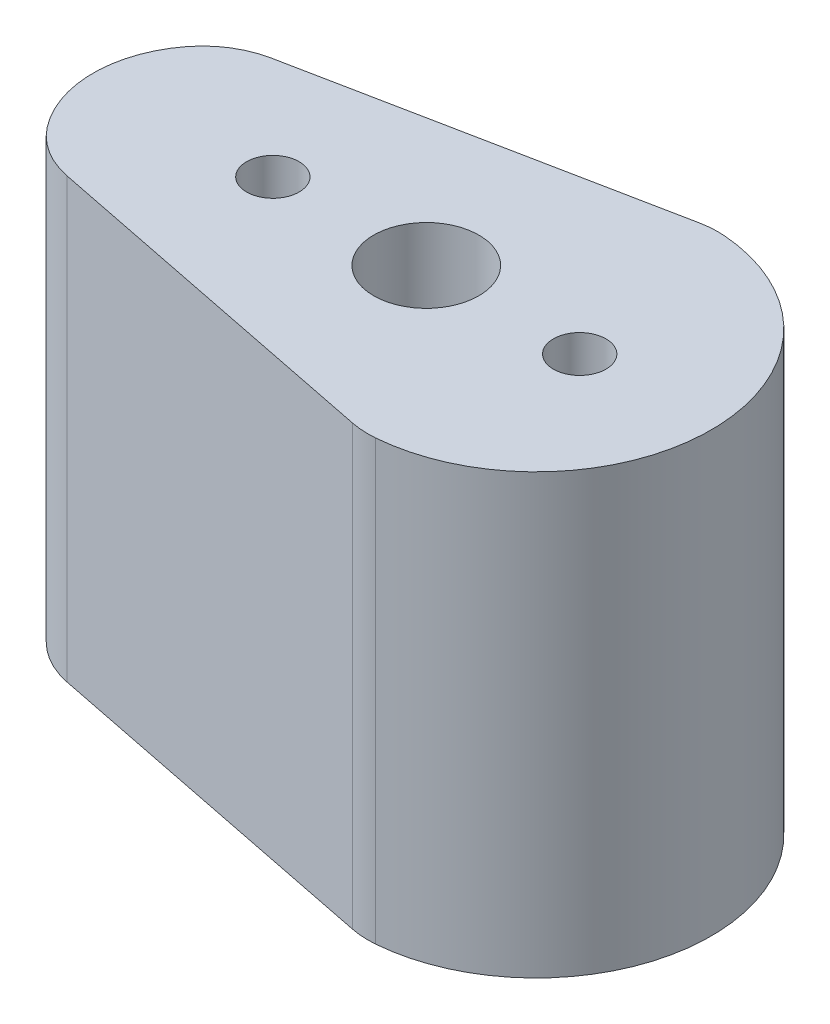
ISO-10303-21;
HEADER;
FILE_DESCRIPTION(('STEP AP214'),'2;1');
FILE_NAME('part.step','',(''),(''),'','','');
FILE_SCHEMA(('AUTOMOTIVE_DESIGN { 1 0 10303 214 1 1 1 1 }'));
ENDSEC;
DATA;
#1=APPLICATION_CONTEXT('core data for automotive mechanical design processes');
#2=APPLICATION_PROTOCOL_DEFINITION('international standard','automotive_design',2000,#1);
#3=PRODUCT_CONTEXT('',#1,'mechanical');
#4=PRODUCT('Part','Part','',(#3));
#5=PRODUCT_RELATED_PRODUCT_CATEGORY('part','',(#4));
#6=PRODUCT_DEFINITION_FORMATION('','',#4);
#7=PRODUCT_DEFINITION_CONTEXT('part definition',#1,'design');
#8=PRODUCT_DEFINITION('design','',#6,#7);
#9=PRODUCT_DEFINITION_SHAPE('','',#8);
#10=(LENGTH_UNIT() NAMED_UNIT(*) SI_UNIT(.MILLI.,.METRE.));
#11=(NAMED_UNIT(*) PLANE_ANGLE_UNIT() SI_UNIT($,.RADIAN.));
#12=(NAMED_UNIT(*) SI_UNIT($,.STERADIAN.) SOLID_ANGLE_UNIT());
#13=UNCERTAINTY_MEASURE_WITH_UNIT(LENGTH_MEASURE(1.E-05),#10,'distance_accuracy_value','');
#14=(GEOMETRIC_REPRESENTATION_CONTEXT(3) GLOBAL_UNCERTAINTY_ASSIGNED_CONTEXT((#13)) GLOBAL_UNIT_ASSIGNED_CONTEXT((#10,
#11,#12)) REPRESENTATION_CONTEXT('',''));
#15=CARTESIAN_POINT('',(0.,0.,0.));
#16=DIRECTION('',(0.,0.,1.));
#17=DIRECTION('',(1.,0.,0.));
#18=AXIS2_PLACEMENT_3D('',#15,#16,#17);
#19=CARTESIAN_POINT('',(-3.9873014814638,5.,0.183542929297438));
#20=DIRECTION('',(0.,-1.,0.));
#21=DIRECTION('',(0.,0.,-1.));
#22=AXIS2_PLACEMENT_3D('',#19,#20,#21);
#23=CYLINDRICAL_SURFACE('',#22,1.);
#24=CARTESIAN_POINT('',(-3.9873014814638,0.,0.183542929297438));
#25=DIRECTION('',(0.,1.,0.));
#26=DIRECTION('',(0.,0.,1.));
#27=AXIS2_PLACEMENT_3D('',#24,#25,#26);
#28=CIRCLE('',#27,1.);
#29=CARTESIAN_POINT('',(-4.183235690524,0.,1.16415997265328));
#30=VERTEX_POINT('',#29);
#31=CARTESIAN_POINT('',(-4.77830641967648,0.,0.795352693622231));
#32=VERTEX_POINT('',#31);
#33=EDGE_CURVE('E160',#30,#32,#28,.F.);
#34=ORIENTED_EDGE('',*,*,#33,.F.);
#35=DIRECTION('',(0.,-1.,0.));
#36=VECTOR('',#35,1.);
#37=CARTESIAN_POINT('',(-4.183235690524,5.,1.16415997265328));
#38=LINE('',#37,#36);
#39=CARTESIAN_POINT('',(-4.183235690524,5.,1.16415997265328));
#40=VERTEX_POINT('',#39);
#41=EDGE_CURVE('E11',#40,#30,#38,.T.);
#42=ORIENTED_EDGE('',*,*,#41,.F.);
#43=CARTESIAN_POINT('',(-3.9873014814638,5.,0.183542929297438));
#44=DIRECTION('',(0.,1.,0.));
#45=DIRECTION('',(0.,0.,1.));
#46=AXIS2_PLACEMENT_3D('',#43,#44,#45);
#47=CIRCLE('',#46,1.);
#48=CARTESIAN_POINT('',(-4.77830641967648,5.,0.795352693622231));
#49=VERTEX_POINT('',#48);
#50=EDGE_CURVE('E238',#40,#49,#47,.F.);
#51=ORIENTED_EDGE('',*,*,#50,.T.);
#52=DIRECTION('',(0.,-1.,0.));
#53=VECTOR('',#52,1.);
#54=CARTESIAN_POINT('',(-4.77830641967648,5.,0.795352693622231));
#55=LINE('',#54,#53);
#56=EDGE_CURVE('E88',#49,#32,#55,.T.);
#57=ORIENTED_EDGE('',*,*,#56,.T.);
#58=EDGE_LOOP('',(#34,#42,#51,#57));
#59=FACE_BOUND('',#58,.T.);
#60=ADVANCED_FACE('F37',(#59),#23,.T.);
#61=CARTESIAN_POINT('',(-0.384272849561752,5.,1.92321957143991));
#62=DIRECTION('',(-0.195934209060197,0.,0.980617043355843));
#63=DIRECTION('',(0.980617043355843,0.,0.195934209060197));
#64=AXIS2_PLACEMENT_3D('',#61,#62,#63);
#65=PLANE('',#64);
#66=DIRECTION('',(-0.980617043355843,0.,-0.195934209060197));
#67=VECTOR('',#66,1.);
#68=CARTESIAN_POINT('',(-0.384272849561752,0.,1.92321957143991));
#69=LINE('',#68,#67);
#70=CARTESIAN_POINT('',(-0.113883759971435,0.,1.97724522066388));
#71=VERTEX_POINT('',#70);
#72=EDGE_CURVE('E154',#71,#30,#69,.T.);
#73=ORIENTED_EDGE('',*,*,#72,.F.);
#74=DIRECTION('',(0.,-1.,0.));
#75=VECTOR('',#74,1.);
#76=CARTESIAN_POINT('',(-0.113883759971435,5.,1.97724522066388));
#77=LINE('',#76,#75);
#78=CARTESIAN_POINT('',(-0.113883759971435,5.,1.97724522066388));
#79=VERTEX_POINT('',#78);
#80=EDGE_CURVE('E46',#79,#71,#77,.T.);
#81=ORIENTED_EDGE('',*,*,#80,.F.);
#82=DIRECTION('',(-0.980617043355843,0.,-0.195934209060197));
#83=VECTOR('',#82,1.);
#84=CARTESIAN_POINT('',(-0.384272849561752,5.,1.92321957143991));
#85=LINE('',#84,#83);
#86=EDGE_CURVE('E240',#79,#40,#85,.T.);
#87=ORIENTED_EDGE('',*,*,#86,.T.);
#88=ORIENTED_EDGE('',*,*,#41,.T.);
#89=EDGE_LOOP('',(#73,#81,#87,#88));
#90=FACE_BOUND('',#89,.T.);
#91=ADVANCED_FACE('F159',(#90),#65,.T.);
#92=CARTESIAN_POINT('',(0.0820504490887623,5.,0.996628177308034));
#93=DIRECTION('',(0.,-1.,0.));
#94=DIRECTION('',(0.,0.,-1.));
#95=AXIS2_PLACEMENT_3D('',#92,#93,#94);
#96=CYLINDRICAL_SURFACE('',#95,1.);
#97=CARTESIAN_POINT('',(0.0820504490887623,0.,0.996628177308034));
#98=DIRECTION('',(0.,1.,0.));
#99=DIRECTION('',(0.,0.,1.));
#100=AXIS2_PLACEMENT_3D('',#97,#98,#99);
#101=CIRCLE('',#100,1.);
#102=CARTESIAN_POINT('',(0.164100898177525,0.,1.99325635461607));
#103=VERTEX_POINT('',#102);
#104=EDGE_CURVE('E144',#71,#103,#101,.T.);
#105=ORIENTED_EDGE('',*,*,#104,.T.);
#106=DIRECTION('',(0.,-1.,0.));
#107=VECTOR('',#106,1.);
#108=CARTESIAN_POINT('',(0.164100898177525,5.,1.99325635461607));
#109=LINE('',#108,#107);
#110=CARTESIAN_POINT('',(0.164100898177525,5.,1.99325635461607));
#111=VERTEX_POINT('',#110);
#112=EDGE_CURVE('E137',#111,#103,#109,.T.);
#113=ORIENTED_EDGE('',*,*,#112,.F.);
#114=CARTESIAN_POINT('',(0.0820504490887623,5.,0.996628177308034));
#115=DIRECTION('',(0.,1.,0.));
#116=DIRECTION('',(0.,0.,1.));
#117=AXIS2_PLACEMENT_3D('',#114,#115,#116);
#118=CIRCLE('',#117,1.);
#119=EDGE_CURVE('E146',#79,#111,#118,.T.);
#120=ORIENTED_EDGE('',*,*,#119,.F.);
#121=ORIENTED_EDGE('',*,*,#80,.T.);
#122=EDGE_LOOP('',(#105,#113,#120,#121));
#123=FACE_BOUND('',#122,.T.);
#124=ADVANCED_FACE('F142',(#123),#96,.T.);
#125=CARTESIAN_POINT('',(-1.05819487287301E-11,5.,-1.28546370596616E-10));
#126=DIRECTION('',(0.,-1.,0.));
#127=DIRECTION('',(0.,0.,-1.));
#128=AXIS2_PLACEMENT_3D('',#125,#126,#127);
#129=CYLINDRICAL_SURFACE('',#128,2.00000000012898);
#130=CARTESIAN_POINT('',(-1.05819487287301E-11,0.,-1.28546370596616E-10));
#131=DIRECTION('',(0.,1.,0.));
#132=DIRECTION('',(0.,0.,1.));
#133=AXIS2_PLACEMENT_3D('',#130,#131,#132);
#134=CIRCLE('',#133,2.00000000012898);
#135=CARTESIAN_POINT('',(0.164100899999999,0.,-1.99325635472312));
#136=VERTEX_POINT('',#135);
#137=EDGE_CURVE('E157',#136,#103,#134,.F.);
#138=ORIENTED_EDGE('',*,*,#137,.F.);
#139=DIRECTION('',(0.,-1.,0.));
#140=VECTOR('',#139,1.);
#141=CARTESIAN_POINT('',(0.164100899999999,5.,-1.99325635472312));
#142=LINE('',#141,#140);
#143=CARTESIAN_POINT('',(0.164100899999999,5.,-1.99325635472312));
#144=VERTEX_POINT('',#143);
#145=EDGE_CURVE('E131',#144,#136,#142,.T.);
#146=ORIENTED_EDGE('',*,*,#145,.F.);
#147=CARTESIAN_POINT('',(-1.05819487287301E-11,5.,-1.28546370596616E-10));
#148=DIRECTION('',(0.,1.,0.));
#149=DIRECTION('',(0.,0.,1.));
#150=AXIS2_PLACEMENT_3D('',#147,#148,#149);
#151=CIRCLE('',#150,2.00000000012898);
#152=EDGE_CURVE('E246',#144,#111,#151,.F.);
#153=ORIENTED_EDGE('',*,*,#152,.T.);
#154=ORIENTED_EDGE('',*,*,#112,.T.);
#155=EDGE_LOOP('',(#138,#146,#153,#154));
#156=FACE_BOUND('',#155,.T.);
#157=ADVANCED_FACE('F212',(#156),#129,.T.);
#158=CARTESIAN_POINT('',(0.0820504499999999,5.,-0.996628177490106));
#159=DIRECTION('',(0.,-1.,0.));
#160=DIRECTION('',(0.,0.,-1.));
#161=AXIS2_PLACEMENT_3D('',#158,#159,#160);
#162=CYLINDRICAL_SURFACE('',#161,1.);
#163=CARTESIAN_POINT('',(0.0820504499999999,0.,-0.996628177490106));
#164=DIRECTION('',(0.,1.,0.));
#165=DIRECTION('',(0.,0.,1.));
#166=AXIS2_PLACEMENT_3D('',#163,#164,#165);
#167=CIRCLE('',#166,1.);
#168=CARTESIAN_POINT('',(-0.113883759060197,0.,-1.97724522084595));
#169=VERTEX_POINT('',#168);
#170=EDGE_CURVE('E167',#136,#169,#167,.T.);
#171=ORIENTED_EDGE('',*,*,#170,.T.);
#172=DIRECTION('',(0.,-1.,0.));
#173=VECTOR('',#172,1.);
#174=CARTESIAN_POINT('',(-0.113883759060197,5.,-1.97724522084595));
#175=LINE('',#174,#173);
#176=CARTESIAN_POINT('',(-0.113883759060197,5.,-1.97724522084595));
#177=VERTEX_POINT('',#176);
#178=EDGE_CURVE('E129',#177,#169,#175,.T.);
#179=ORIENTED_EDGE('',*,*,#178,.F.);
#180=CARTESIAN_POINT('',(0.0820504499999999,5.,-0.996628177490106));
#181=DIRECTION('',(0.,1.,0.));
#182=DIRECTION('',(0.,0.,1.));
#183=AXIS2_PLACEMENT_3D('',#180,#181,#182);
#184=CIRCLE('',#183,1.);
#185=EDGE_CURVE('E122',#144,#177,#184,.T.);
#186=ORIENTED_EDGE('',*,*,#185,.F.);
#187=ORIENTED_EDGE('',*,*,#145,.T.);
#188=EDGE_LOOP('',(#171,#179,#186,#187));
#189=FACE_BOUND('',#188,.T.);
#190=ADVANCED_FACE('F215',(#189),#162,.T.);
#191=CARTESIAN_POINT('',(-0.384272849561752,5.,-1.92321957143991));
#192=DIRECTION('',(0.195934209060197,0.,0.980617043355843));
#193=DIRECTION('',(0.980617043355843,0.,-0.195934209060197));
#194=AXIS2_PLACEMENT_3D('',#191,#192,#193);
#195=PLANE('',#194);
#196=DIRECTION('',(-0.980617043355843,0.,0.195934209060197));
#197=VECTOR('',#196,1.);
#198=CARTESIAN_POINT('',(-0.384272849561752,0.,-1.92321957143991));
#199=LINE('',#198,#197);
#200=CARTESIAN_POINT('',(-4.183235690524,0.,-1.16415997265328));
#201=VERTEX_POINT('',#200);
#202=EDGE_CURVE('E128',#169,#201,#199,.T.);
#203=ORIENTED_EDGE('',*,*,#202,.T.);
#204=DIRECTION('',(0.,-1.,0.));
#205=VECTOR('',#204,1.);
#206=CARTESIAN_POINT('',(-4.183235690524,5.,-1.16415997265328));
#207=LINE('',#206,#205);
#208=CARTESIAN_POINT('',(-4.183235690524,5.,-1.16415997265328));
#209=VERTEX_POINT('',#208);
#210=EDGE_CURVE('E112',#209,#201,#207,.T.);
#211=ORIENTED_EDGE('',*,*,#210,.F.);
#212=DIRECTION('',(-0.980617043355843,0.,0.195934209060197));
#213=VECTOR('',#212,1.);
#214=CARTESIAN_POINT('',(-0.384272849561752,5.,-1.92321957143991));
#215=LINE('',#214,#213);
#216=EDGE_CURVE('E115',#177,#209,#215,.T.);
#217=ORIENTED_EDGE('',*,*,#216,.F.);
#218=ORIENTED_EDGE('',*,*,#178,.T.);
#219=EDGE_LOOP('',(#203,#211,#217,#218));
#220=FACE_BOUND('',#219,.T.);
#221=ADVANCED_FACE('F127',(#220),#195,.F.);
#222=CARTESIAN_POINT('',(-3.9873014814638,5.,-0.183542929297438));
#223=DIRECTION('',(0.,-1.,0.));
#224=DIRECTION('',(0.,0.,-1.));
#225=AXIS2_PLACEMENT_3D('',#222,#223,#224);
#226=CYLINDRICAL_SURFACE('',#225,1.);
#227=CARTESIAN_POINT('',(-3.9873014814638,0.,-0.183542929297438));
#228=DIRECTION('',(0.,1.,0.));
#229=DIRECTION('',(0.,0.,1.));
#230=AXIS2_PLACEMENT_3D('',#227,#228,#229);
#231=CIRCLE('',#230,1.);
#232=CARTESIAN_POINT('',(-4.77830641967648,0.,-0.795352693622231));
#233=VERTEX_POINT('',#232);
#234=EDGE_CURVE('E171',#201,#233,#231,.T.);
#235=ORIENTED_EDGE('',*,*,#234,.T.);
#236=DIRECTION('',(0.,-1.,0.));
#237=VECTOR('',#236,1.);
#238=CARTESIAN_POINT('',(-4.77830641967648,5.,-0.795352693622231));
#239=LINE('',#238,#237);
#240=CARTESIAN_POINT('',(-4.77830641967648,5.,-0.795352693622231));
#241=VERTEX_POINT('',#240);
#242=EDGE_CURVE('E114',#241,#233,#239,.T.);
#243=ORIENTED_EDGE('',*,*,#242,.F.);
#244=CARTESIAN_POINT('',(-3.9873014814638,5.,-0.183542929297438));
#245=DIRECTION('',(0.,1.,0.));
#246=DIRECTION('',(0.,0.,1.));
#247=AXIS2_PLACEMENT_3D('',#244,#245,#246);
#248=CIRCLE('',#247,1.);
#249=EDGE_CURVE('E107',#209,#241,#248,.T.);
#250=ORIENTED_EDGE('',*,*,#249,.F.);
#251=ORIENTED_EDGE('',*,*,#210,.T.);
#252=EDGE_LOOP('',(#235,#243,#250,#251));
#253=FACE_BOUND('',#252,.T.);
#254=ADVANCED_FACE('F110',(#253),#226,.T.);
#255=CARTESIAN_POINT('',(-3.75,5.,0.));
#256=DIRECTION('',(0.,-1.,0.));
#257=DIRECTION('',(0.,0.,-1.));
#258=AXIS2_PLACEMENT_3D('',#255,#256,#257);
#259=CYLINDRICAL_SURFACE('',#258,1.3);
#260=CARTESIAN_POINT('',(-3.75,0.,0.));
#261=DIRECTION('',(0.,1.,0.));
#262=DIRECTION('',(0.,0.,1.));
#263=AXIS2_PLACEMENT_3D('',#260,#261,#262);
#264=CIRCLE('',#263,1.3);
#265=EDGE_CURVE('E81',#233,#32,#264,.T.);
#266=ORIENTED_EDGE('',*,*,#265,.T.);
#267=ORIENTED_EDGE('',*,*,#56,.F.);
#268=CARTESIAN_POINT('',(-3.75,5.,0.));
#269=DIRECTION('',(0.,1.,0.));
#270=DIRECTION('',(0.,0.,1.));
#271=AXIS2_PLACEMENT_3D('',#268,#269,#270);
#272=CIRCLE('',#271,1.3);
#273=EDGE_CURVE('E54',#241,#49,#272,.T.);
#274=ORIENTED_EDGE('',*,*,#273,.F.);
#275=ORIENTED_EDGE('',*,*,#242,.T.);
#276=EDGE_LOOP('',(#266,#267,#274,#275));
#277=FACE_BOUND('',#276,.T.);
#278=ADVANCED_FACE('F192',(#277),#259,.T.);
#279=CARTESIAN_POINT('',(-3.,5.,0.));
#280=DIRECTION('',(0.,-1.,0.));
#281=DIRECTION('',(0.,0.,-1.));
#282=AXIS2_PLACEMENT_3D('',#279,#280,#281);
#283=CYLINDRICAL_SURFACE('',#282,0.3);
#284=CARTESIAN_POINT('',(-3.,5.,0.));
#285=DIRECTION('',(0.,1.,0.));
#286=DIRECTION('',(0.,0.,1.));
#287=AXIS2_PLACEMENT_3D('',#284,#285,#286);
#288=CIRCLE('',#287,0.3);
#289=CARTESIAN_POINT('',(-3.,5.,0.3));
#290=VERTEX_POINT('',#289);
#291=EDGE_CURVE('E237',#290,#290,#288,.T.);
#292=ORIENTED_EDGE('',*,*,#291,.T.);
#293=EDGE_LOOP('',(#292));
#294=FACE_BOUND('',#293,.T.);
#295=CARTESIAN_POINT('',(-3.,0.,0.));
#296=DIRECTION('',(0.,1.,0.));
#297=DIRECTION('',(0.,0.,1.));
#298=AXIS2_PLACEMENT_3D('',#295,#296,#297);
#299=CIRCLE('',#298,0.3);
#300=CARTESIAN_POINT('',(-3.,0.,0.3));
#301=VERTEX_POINT('',#300);
#302=EDGE_CURVE('E162',#301,#301,#299,.T.);
#303=ORIENTED_EDGE('',*,*,#302,.F.);
#304=EDGE_LOOP('',(#303));
#305=FACE_BOUND('',#304,.T.);
#306=ADVANCED_FACE('F190',(#294,#305),#283,.F.);
#307=CARTESIAN_POINT('',(0.5,5.,0.));
#308=DIRECTION('',(0.,-1.,0.));
#309=DIRECTION('',(0.,0.,-1.));
#310=AXIS2_PLACEMENT_3D('',#307,#308,#309);
#311=CYLINDRICAL_SURFACE('',#310,0.3);
#312=CARTESIAN_POINT('',(0.5,5.,0.));
#313=DIRECTION('',(0.,1.,0.));
#314=DIRECTION('',(0.,0.,1.));
#315=AXIS2_PLACEMENT_3D('',#312,#313,#314);
#316=CIRCLE('',#315,0.3);
#317=CARTESIAN_POINT('',(0.5,5.,0.3));
#318=VERTEX_POINT('',#317);
#319=EDGE_CURVE('E176',#318,#318,#316,.T.);
#320=ORIENTED_EDGE('',*,*,#319,.T.);
#321=EDGE_LOOP('',(#320));
#322=FACE_BOUND('',#321,.T.);
#323=CARTESIAN_POINT('',(0.5,0.,0.));
#324=DIRECTION('',(0.,1.,0.));
#325=DIRECTION('',(0.,0.,1.));
#326=AXIS2_PLACEMENT_3D('',#323,#324,#325);
#327=CIRCLE('',#326,0.3);
#328=CARTESIAN_POINT('',(0.5,0.,0.3));
#329=VERTEX_POINT('',#328);
#330=EDGE_CURVE('E184',#329,#329,#327,.T.);
#331=ORIENTED_EDGE('',*,*,#330,.F.);
#332=EDGE_LOOP('',(#331));
#333=FACE_BOUND('',#332,.T.);
#334=ADVANCED_FACE('F39',(#322,#333),#311,.F.);
#335=CARTESIAN_POINT('',(-1.24999999999968,5.,0.));
#336=DIRECTION('',(0.,-1.,0.));
#337=DIRECTION('',(0.,0.,-1.));
#338=AXIS2_PLACEMENT_3D('',#335,#336,#337);
#339=CYLINDRICAL_SURFACE('',#338,0.6);
#340=CARTESIAN_POINT('',(-1.24999999999968,5.,0.));
#341=DIRECTION('',(0.,1.,0.));
#342=DIRECTION('',(0.,0.,1.));
#343=AXIS2_PLACEMENT_3D('',#340,#341,#342);
#344=CIRCLE('',#343,0.6);
#345=CARTESIAN_POINT('',(-1.24999999999968,5.,0.599999999999994));
#346=VERTEX_POINT('',#345);
#347=EDGE_CURVE('E177',#346,#346,#344,.T.);
#348=ORIENTED_EDGE('',*,*,#347,.T.);
#349=EDGE_LOOP('',(#348));
#350=FACE_BOUND('',#349,.T.);
#351=CARTESIAN_POINT('',(-1.24999999999968,0.,0.));
#352=DIRECTION('',(0.,1.,0.));
#353=DIRECTION('',(0.,0.,1.));
#354=AXIS2_PLACEMENT_3D('',#351,#352,#353);
#355=CIRCLE('',#354,0.6);
#356=CARTESIAN_POINT('',(-1.24999999999968,0.,0.599999999999994));
#357=VERTEX_POINT('',#356);
#358=EDGE_CURVE('E174',#357,#357,#355,.T.);
#359=ORIENTED_EDGE('',*,*,#358,.F.);
#360=EDGE_LOOP('',(#359));
#361=FACE_BOUND('',#360,.T.);
#362=ADVANCED_FACE('F198',(#350,#361),#339,.F.);
#363=CARTESIAN_POINT('',(0.,5.,0.));
#364=DIRECTION('',(0.,1.,0.));
#365=DIRECTION('',(0.,0.,1.));
#366=AXIS2_PLACEMENT_3D('',#363,#364,#365);
#367=PLANE('',#366);
#368=ORIENTED_EDGE('',*,*,#319,.F.);
#369=EDGE_LOOP('',(#368));
#370=FACE_BOUND('',#369,.T.);
#371=ORIENTED_EDGE('',*,*,#291,.F.);
#372=EDGE_LOOP('',(#371));
#373=FACE_BOUND('',#372,.T.);
#374=ORIENTED_EDGE('',*,*,#50,.F.);
#375=ORIENTED_EDGE('',*,*,#86,.F.);
#376=ORIENTED_EDGE('',*,*,#119,.T.);
#377=ORIENTED_EDGE('',*,*,#152,.F.);
#378=ORIENTED_EDGE('',*,*,#185,.T.);
#379=ORIENTED_EDGE('',*,*,#216,.T.);
#380=ORIENTED_EDGE('',*,*,#249,.T.);
#381=ORIENTED_EDGE('',*,*,#273,.T.);
#382=EDGE_LOOP('',(#374,#375,#376,#377,#378,#379,#380,#381));
#383=FACE_BOUND('',#382,.T.);
#384=ORIENTED_EDGE('',*,*,#347,.F.);
#385=EDGE_LOOP('',(#384));
#386=FACE_BOUND('',#385,.T.);
#387=ADVANCED_FACE('F118',(#370,#373,#383,#386),#367,.T.);
#388=CARTESIAN_POINT('',(0.,0.,0.));
#389=DIRECTION('',(0.,1.,0.));
#390=DIRECTION('',(0.,0.,1.));
#391=AXIS2_PLACEMENT_3D('',#388,#389,#390);
#392=PLANE('',#391);
#393=ORIENTED_EDGE('',*,*,#330,.T.);
#394=EDGE_LOOP('',(#393));
#395=FACE_BOUND('',#394,.T.);
#396=ORIENTED_EDGE('',*,*,#302,.T.);
#397=EDGE_LOOP('',(#396));
#398=FACE_BOUND('',#397,.T.);
#399=ORIENTED_EDGE('',*,*,#33,.T.);
#400=ORIENTED_EDGE('',*,*,#265,.F.);
#401=ORIENTED_EDGE('',*,*,#234,.F.);
#402=ORIENTED_EDGE('',*,*,#202,.F.);
#403=ORIENTED_EDGE('',*,*,#170,.F.);
#404=ORIENTED_EDGE('',*,*,#137,.T.);
#405=ORIENTED_EDGE('',*,*,#104,.F.);
#406=ORIENTED_EDGE('',*,*,#72,.T.);
#407=EDGE_LOOP('',(#399,#400,#401,#402,#403,#404,#405,#406));
#408=FACE_BOUND('',#407,.T.);
#409=ORIENTED_EDGE('',*,*,#358,.T.);
#410=EDGE_LOOP('',(#409));
#411=FACE_BOUND('',#410,.T.);
#412=ADVANCED_FACE('F152',(#395,#398,#408,#411),#392,.F.);
#413=CLOSED_SHELL('',(#60,#91,#124,#157,#190,#221,#254,#278,#306,#334,#362,#387,#412));
#414=MANIFOLD_SOLID_BREP('B2',#413);
#415=ADVANCED_BREP_SHAPE_REPRESENTATION('',(#18,#414),#14);
#416=SHAPE_DEFINITION_REPRESENTATION(#9,#415);
ENDSEC;
END-ISO-10303-21;
